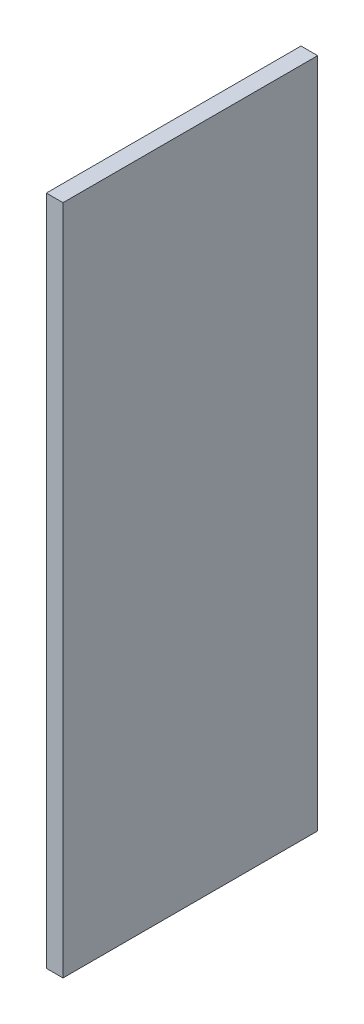
ISO-10303-21;
HEADER;
FILE_DESCRIPTION(('STEP AP214'),'2;1');
FILE_NAME('part.step','',(''),(''),'','','');
FILE_SCHEMA(('AUTOMOTIVE_DESIGN { 1 0 10303 214 1 1 1 1 }'));
ENDSEC;
DATA;
#1=APPLICATION_CONTEXT('core data for automotive mechanical design processes');
#2=APPLICATION_PROTOCOL_DEFINITION('international standard','automotive_design',2000,#1);
#3=PRODUCT_CONTEXT('',#1,'mechanical');
#4=PRODUCT('Part','Part','',(#3));
#5=PRODUCT_RELATED_PRODUCT_CATEGORY('part','',(#4));
#6=PRODUCT_DEFINITION_FORMATION('','',#4);
#7=PRODUCT_DEFINITION_CONTEXT('part definition',#1,'design');
#8=PRODUCT_DEFINITION('design','',#6,#7);
#9=PRODUCT_DEFINITION_SHAPE('','',#8);
#10=(LENGTH_UNIT() NAMED_UNIT(*) SI_UNIT(.MILLI.,.METRE.));
#11=(NAMED_UNIT(*) PLANE_ANGLE_UNIT() SI_UNIT($,.RADIAN.));
#12=(NAMED_UNIT(*) SI_UNIT($,.STERADIAN.) SOLID_ANGLE_UNIT());
#13=UNCERTAINTY_MEASURE_WITH_UNIT(LENGTH_MEASURE(1.E-05),#10,'distance_accuracy_value','');
#14=(GEOMETRIC_REPRESENTATION_CONTEXT(3) GLOBAL_UNCERTAINTY_ASSIGNED_CONTEXT((#13)) GLOBAL_UNIT_ASSIGNED_CONTEXT((#10,
#11,#12)) REPRESENTATION_CONTEXT('',''));
#15=CARTESIAN_POINT('',(0.,0.,0.));
#16=DIRECTION('',(0.,0.,1.));
#17=DIRECTION('',(1.,0.,0.));
#18=AXIS2_PLACEMENT_3D('',#15,#16,#17);
#19=CARTESIAN_POINT('',(18.288,-368.3,139.7));
#20=DIRECTION('',(0.,0.,-1.));
#21=DIRECTION('',(-1.,0.,0.));
#22=AXIS2_PLACEMENT_3D('',#19,#20,#21);
#23=PLANE('',#22);
#24=DIRECTION('',(0.,-1.,0.));
#25=VECTOR('',#24,1.);
#26=CARTESIAN_POINT('',(0.,-368.3,139.7));
#27=LINE('',#26,#25);
#28=CARTESIAN_POINT('',(0.,368.3,139.7));
#29=VERTEX_POINT('',#28);
#30=CARTESIAN_POINT('',(0.,-368.3,139.7));
#31=VERTEX_POINT('',#30);
#32=EDGE_CURVE('E97',#29,#31,#27,.T.);
#33=ORIENTED_EDGE('',*,*,#32,.T.);
#34=DIRECTION('',(-1.,0.,0.));
#35=VECTOR('',#34,1.);
#36=CARTESIAN_POINT('',(18.288,-368.3,139.7));
#37=LINE('',#36,#35);
#38=CARTESIAN_POINT('',(18.288,-368.3,139.7));
#39=VERTEX_POINT('',#38);
#40=EDGE_CURVE('E11',#39,#31,#37,.T.);
#41=ORIENTED_EDGE('',*,*,#40,.F.);
#42=DIRECTION('',(0.,-1.,0.));
#43=VECTOR('',#42,1.);
#44=CARTESIAN_POINT('',(18.288,-368.3,139.7));
#45=LINE('',#44,#43);
#46=CARTESIAN_POINT('',(18.288,368.3,139.7));
#47=VERTEX_POINT('',#46);
#48=EDGE_CURVE('E85',#47,#39,#45,.T.);
#49=ORIENTED_EDGE('',*,*,#48,.F.);
#50=DIRECTION('',(-1.,0.,0.));
#51=VECTOR('',#50,1.);
#52=CARTESIAN_POINT('',(18.288,368.3,139.7));
#53=LINE('',#52,#51);
#54=EDGE_CURVE('E93',#47,#29,#53,.T.);
#55=ORIENTED_EDGE('',*,*,#54,.T.);
#56=EDGE_LOOP('',(#33,#41,#49,#55));
#57=FACE_BOUND('',#56,.T.);
#58=ADVANCED_FACE('F34',(#57),#23,.F.);
#59=CARTESIAN_POINT('',(18.288,-368.3,-139.7));
#60=DIRECTION('',(0.,1.,0.));
#61=DIRECTION('',(0.,0.,1.));
#62=AXIS2_PLACEMENT_3D('',#59,#60,#61);
#63=PLANE('',#62);
#64=DIRECTION('',(0.,0.,-1.));
#65=VECTOR('',#64,1.);
#66=CARTESIAN_POINT('',(0.,-368.3,-139.7));
#67=LINE('',#66,#65);
#68=CARTESIAN_POINT('',(0.,-368.3,-139.7));
#69=VERTEX_POINT('',#68);
#70=EDGE_CURVE('E89',#31,#69,#67,.T.);
#71=ORIENTED_EDGE('',*,*,#70,.T.);
#72=DIRECTION('',(-1.,0.,0.));
#73=VECTOR('',#72,1.);
#74=CARTESIAN_POINT('',(18.288,-368.3,-139.7));
#75=LINE('',#74,#73);
#76=CARTESIAN_POINT('',(18.288,-368.3,-139.7));
#77=VERTEX_POINT('',#76);
#78=EDGE_CURVE('E42',#77,#69,#75,.T.);
#79=ORIENTED_EDGE('',*,*,#78,.F.);
#80=DIRECTION('',(0.,0.,-1.));
#81=VECTOR('',#80,1.);
#82=CARTESIAN_POINT('',(18.288,-368.3,-139.7));
#83=LINE('',#82,#81);
#84=EDGE_CURVE('E80',#39,#77,#83,.T.);
#85=ORIENTED_EDGE('',*,*,#84,.F.);
#86=ORIENTED_EDGE('',*,*,#40,.T.);
#87=EDGE_LOOP('',(#71,#79,#85,#86));
#88=FACE_BOUND('',#87,.T.);
#89=ADVANCED_FACE('F88',(#88),#63,.F.);
#90=CARTESIAN_POINT('',(18.288,-368.3,-139.7));
#91=DIRECTION('',(0.,0.,1.));
#92=DIRECTION('',(1.,0.,0.));
#93=AXIS2_PLACEMENT_3D('',#90,#91,#92);
#94=PLANE('',#93);
#95=DIRECTION('',(0.,1.,0.));
#96=VECTOR('',#95,1.);
#97=CARTESIAN_POINT('',(0.,-368.3,-139.7));
#98=LINE('',#97,#96);
#99=CARTESIAN_POINT('',(0.,368.3,-139.7));
#100=VERTEX_POINT('',#99);
#101=EDGE_CURVE('E67',#69,#100,#98,.T.);
#102=ORIENTED_EDGE('',*,*,#101,.T.);
#103=DIRECTION('',(-1.,0.,0.));
#104=VECTOR('',#103,1.);
#105=CARTESIAN_POINT('',(18.288,368.3,-139.7));
#106=LINE('',#105,#104);
#107=CARTESIAN_POINT('',(18.288,368.3,-139.7));
#108=VERTEX_POINT('',#107);
#109=EDGE_CURVE('E90',#108,#100,#106,.T.);
#110=ORIENTED_EDGE('',*,*,#109,.F.);
#111=DIRECTION('',(0.,1.,0.));
#112=VECTOR('',#111,1.);
#113=CARTESIAN_POINT('',(18.288,-368.3,-139.7));
#114=LINE('',#113,#112);
#115=EDGE_CURVE('E83',#77,#108,#114,.T.);
#116=ORIENTED_EDGE('',*,*,#115,.F.);
#117=ORIENTED_EDGE('',*,*,#78,.T.);
#118=EDGE_LOOP('',(#102,#110,#116,#117));
#119=FACE_BOUND('',#118,.T.);
#120=ADVANCED_FACE('F91',(#119),#94,.F.);
#121=CARTESIAN_POINT('',(18.288,368.3,-139.7));
#122=DIRECTION('',(0.,-1.,0.));
#123=DIRECTION('',(0.,0.,-1.));
#124=AXIS2_PLACEMENT_3D('',#121,#122,#123);
#125=PLANE('',#124);
#126=DIRECTION('',(0.,0.,1.));
#127=VECTOR('',#126,1.);
#128=CARTESIAN_POINT('',(0.,368.3,-139.7));
#129=LINE('',#128,#127);
#130=EDGE_CURVE('E73',#100,#29,#129,.T.);
#131=ORIENTED_EDGE('',*,*,#130,.T.);
#132=ORIENTED_EDGE('',*,*,#54,.F.);
#133=DIRECTION('',(0.,0.,1.));
#134=VECTOR('',#133,1.);
#135=CARTESIAN_POINT('',(18.288,368.3,-139.7));
#136=LINE('',#135,#134);
#137=EDGE_CURVE('E50',#108,#47,#136,.T.);
#138=ORIENTED_EDGE('',*,*,#137,.F.);
#139=ORIENTED_EDGE('',*,*,#109,.T.);
#140=EDGE_LOOP('',(#131,#132,#138,#139));
#141=FACE_BOUND('',#140,.T.);
#142=ADVANCED_FACE('F104',(#141),#125,.F.);
#143=CARTESIAN_POINT('',(18.288,0.,0.));
#144=DIRECTION('',(1.,0.,0.));
#145=DIRECTION('',(0.,0.,-1.));
#146=AXIS2_PLACEMENT_3D('',#143,#144,#145);
#147=PLANE('',#146);
#148=ORIENTED_EDGE('',*,*,#48,.T.);
#149=ORIENTED_EDGE('',*,*,#84,.T.);
#150=ORIENTED_EDGE('',*,*,#115,.T.);
#151=ORIENTED_EDGE('',*,*,#137,.T.);
#152=EDGE_LOOP('',(#148,#149,#150,#151));
#153=FACE_BOUND('',#152,.T.);
#154=ADVANCED_FACE('F81',(#153),#147,.T.);
#155=CARTESIAN_POINT('',(0.,0.,0.));
#156=DIRECTION('',(1.,0.,0.));
#157=DIRECTION('',(0.,0.,-1.));
#158=AXIS2_PLACEMENT_3D('',#155,#156,#157);
#159=PLANE('',#158);
#160=ORIENTED_EDGE('',*,*,#32,.F.);
#161=ORIENTED_EDGE('',*,*,#130,.F.);
#162=ORIENTED_EDGE('',*,*,#101,.F.);
#163=ORIENTED_EDGE('',*,*,#70,.F.);
#164=EDGE_LOOP('',(#160,#161,#162,#163));
#165=FACE_BOUND('',#164,.T.);
#166=ADVANCED_FACE('F107',(#165),#159,.F.);
#167=CLOSED_SHELL('',(#58,#89,#120,#142,#154,#166));
#168=MANIFOLD_SOLID_BREP('B2',#167);
#169=ADVANCED_BREP_SHAPE_REPRESENTATION('',(#18,#168),#14);
#170=SHAPE_DEFINITION_REPRESENTATION(#9,#169);
ENDSEC;
END-ISO-10303-21;
